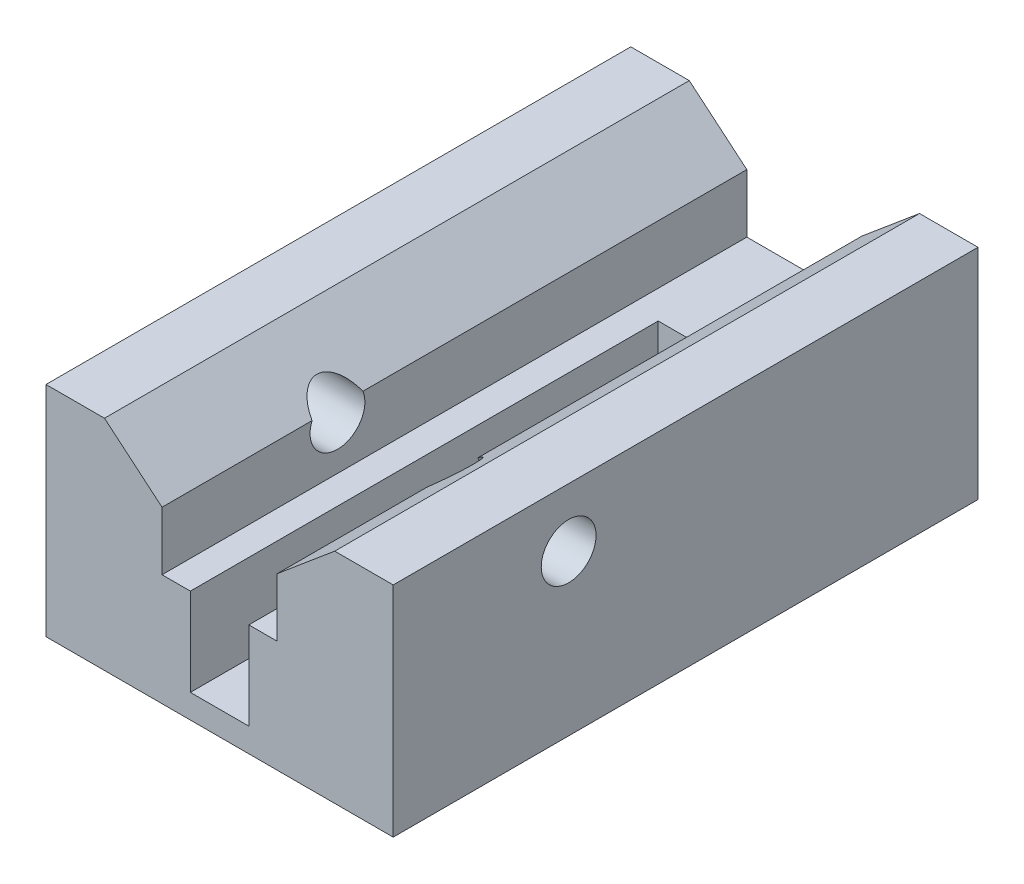
ISO-10303-21;
HEADER;
FILE_DESCRIPTION(('STEP AP214'),'2;1');
FILE_NAME('part.step','',(''),(''),'','','');
FILE_SCHEMA(('AUTOMOTIVE_DESIGN { 1 0 10303 214 1 1 1 1 }'));
ENDSEC;
DATA;
#1=APPLICATION_CONTEXT('core data for automotive mechanical design processes');
#2=APPLICATION_PROTOCOL_DEFINITION('international standard','automotive_design',2000,#1);
#3=PRODUCT_CONTEXT('',#1,'mechanical');
#4=PRODUCT('Part','Part','',(#3));
#5=PRODUCT_RELATED_PRODUCT_CATEGORY('part','',(#4));
#6=PRODUCT_DEFINITION_FORMATION('','',#4);
#7=PRODUCT_DEFINITION_CONTEXT('part definition',#1,'design');
#8=PRODUCT_DEFINITION('design','',#6,#7);
#9=PRODUCT_DEFINITION_SHAPE('','',#8);
#10=(LENGTH_UNIT() NAMED_UNIT(*) SI_UNIT(.MILLI.,.METRE.));
#11=(NAMED_UNIT(*) PLANE_ANGLE_UNIT() SI_UNIT($,.RADIAN.));
#12=(NAMED_UNIT(*) SI_UNIT($,.STERADIAN.) SOLID_ANGLE_UNIT());
#13=UNCERTAINTY_MEASURE_WITH_UNIT(LENGTH_MEASURE(1.E-05),#10,'distance_accuracy_value','');
#14=(GEOMETRIC_REPRESENTATION_CONTEXT(3) GLOBAL_UNCERTAINTY_ASSIGNED_CONTEXT((#13)) GLOBAL_UNIT_ASSIGNED_CONTEXT((#10,
#11,#12)) REPRESENTATION_CONTEXT('',''));
#15=CARTESIAN_POINT('',(0.,0.,0.));
#16=DIRECTION('',(0.,0.,1.));
#17=DIRECTION('',(1.,0.,0.));
#18=AXIS2_PLACEMENT_3D('',#15,#16,#17);
#19=CARTESIAN_POINT('',(-2.5,2.54,25.4));
#20=DIRECTION('',(-0.642787609686543,-0.766044443118975,0.));
#21=DIRECTION('',(0.766044443118975,-0.642787609686543,0.));
#22=AXIS2_PLACEMENT_3D('',#19,#20,#21);
#23=PLANE('',#22);
#24=DIRECTION('',(0.,0.,-1.));
#25=VECTOR('',#24,1.);
#26=CARTESIAN_POINT('',(-2.5,2.54,25.4));
#27=LINE('',#26,#25);
#28=CARTESIAN_POINT('',(-2.5,2.54,25.4));
#29=VERTEX_POINT('',#28);
#30=CARTESIAN_POINT('',(-2.5,2.54,18.885441998734));
#31=VERTEX_POINT('',#30);
#32=EDGE_CURVE('E151',#29,#31,#27,.T.);
#33=ORIENTED_EDGE('',*,*,#32,.T.);
#34=CARTESIAN_POINT('',(-1.97294587481074,2.09774907794322,17.78));
#35=DIRECTION('',(-0.642787609686543,-0.766044443118975,0.));
#36=DIRECTION('',(0.766044443118975,-0.642787609686543,0.));
#37=AXIS2_PLACEMENT_3D('',#34,#35,#36);
#38=ELLIPSE('',#37,1.85228368135567,1.190625);
#39=CARTESIAN_POINT('',(-2.5,2.54,16.674558001266));
#40=VERTEX_POINT('',#39);
#41=EDGE_CURVE('E53',#31,#40,#38,.T.);
#42=ORIENTED_EDGE('',*,*,#41,.T.);
#43=CARTESIAN_POINT('',(-2.5,2.54,0.));
#44=VERTEX_POINT('',#43);
#45=EDGE_CURVE('E148',#40,#44,#27,.T.);
#46=ORIENTED_EDGE('',*,*,#45,.T.);
#47=DIRECTION('',(-0.766044443118975,0.642787609686543,0.));
#48=VECTOR('',#47,1.);
#49=CARTESIAN_POINT('',(-2.5,2.54,0.));
#50=LINE('',#49,#48);
#51=CARTESIAN_POINT('',(-5.,4.63774907794322,0.));
#52=VERTEX_POINT('',#51);
#53=EDGE_CURVE('E198',#44,#52,#50,.T.);
#54=ORIENTED_EDGE('',*,*,#53,.T.);
#55=DIRECTION('',(0.,0.,-1.));
#56=VECTOR('',#55,1.);
#57=CARTESIAN_POINT('',(-5.,4.63774907794322,25.4));
#58=LINE('',#57,#56);
#59=CARTESIAN_POINT('',(-5.,4.63774907794322,25.4));
#60=VERTEX_POINT('',#59);
#61=EDGE_CURVE('E40',#60,#52,#58,.T.);
#62=ORIENTED_EDGE('',*,*,#61,.F.);
#63=DIRECTION('',(-0.766044443118975,0.642787609686543,0.));
#64=VECTOR('',#63,1.);
#65=CARTESIAN_POINT('',(-2.5,2.54,25.4));
#66=LINE('',#65,#64);
#67=EDGE_CURVE('E223',#29,#60,#66,.T.);
#68=ORIENTED_EDGE('',*,*,#67,.F.);
#69=EDGE_LOOP('',(#33,#42,#46,#54,#62,#68));
#70=FACE_BOUND('',#69,.T.);
#71=ADVANCED_FACE('F33',(#70),#23,.F.);
#72=CARTESIAN_POINT('',(-5.,4.63774907794322,25.4));
#73=DIRECTION('',(0.,-1.,0.));
#74=DIRECTION('',(1.,0.,0.));
#75=AXIS2_PLACEMENT_3D('',#72,#73,#74);
#76=PLANE('',#75);
#77=DIRECTION('',(-1.,0.,0.));
#78=VECTOR('',#77,1.);
#79=CARTESIAN_POINT('',(-5.,4.63774907794322,0.));
#80=LINE('',#79,#78);
#81=CARTESIAN_POINT('',(-7.54,4.63774907794322,0.));
#82=VERTEX_POINT('',#81);
#83=EDGE_CURVE('E195',#52,#82,#80,.T.);
#84=ORIENTED_EDGE('',*,*,#83,.T.);
#85=DIRECTION('',(0.,0.,-1.));
#86=VECTOR('',#85,1.);
#87=CARTESIAN_POINT('',(-7.54,4.63774907794322,25.4));
#88=LINE('',#87,#86);
#89=CARTESIAN_POINT('',(-7.54,4.63774907794322,25.4));
#90=VERTEX_POINT('',#89);
#91=EDGE_CURVE('E188',#90,#82,#88,.T.);
#92=ORIENTED_EDGE('',*,*,#91,.F.);
#93=DIRECTION('',(-1.,0.,0.));
#94=VECTOR('',#93,1.);
#95=CARTESIAN_POINT('',(-5.,4.63774907794322,25.4));
#96=LINE('',#95,#94);
#97=EDGE_CURVE('E196',#60,#90,#96,.T.);
#98=ORIENTED_EDGE('',*,*,#97,.F.);
#99=ORIENTED_EDGE('',*,*,#61,.T.);
#100=EDGE_LOOP('',(#84,#92,#98,#99));
#101=FACE_BOUND('',#100,.T.);
#102=ADVANCED_FACE('F193',(#101),#76,.F.);
#103=CARTESIAN_POINT('',(-7.54,4.63774907794322,25.4));
#104=DIRECTION('',(1.,0.,0.));
#105=DIRECTION('',(0.,1.,0.));
#106=AXIS2_PLACEMENT_3D('',#103,#104,#105);
#107=PLANE('',#106);
#108=CARTESIAN_POINT('',(-7.54,2.09774907794322,17.78));
#109=DIRECTION('',(1.,0.,0.));
#110=DIRECTION('',(0.,1.,0.));
#111=AXIS2_PLACEMENT_3D('',#108,#109,#110);
#112=CIRCLE('',#111,1.190625);
#113=CARTESIAN_POINT('',(-7.54,3.28837407794322,17.78));
#114=VERTEX_POINT('',#113);
#115=EDGE_CURVE('E153',#114,#114,#112,.T.);
#116=ORIENTED_EDGE('',*,*,#115,.T.);
#117=EDGE_LOOP('',(#116));
#118=FACE_BOUND('',#117,.T.);
#119=DIRECTION('',(0.,-1.,0.));
#120=VECTOR('',#119,1.);
#121=CARTESIAN_POINT('',(-7.54,4.63774907794322,0.));
#122=LINE('',#121,#120);
#123=CARTESIAN_POINT('',(-7.54,-4.85143615091344,0.));
#124=VERTEX_POINT('',#123);
#125=EDGE_CURVE('E202',#82,#124,#122,.T.);
#126=ORIENTED_EDGE('',*,*,#125,.T.);
#127=DIRECTION('',(0.,0.,-1.));
#128=VECTOR('',#127,1.);
#129=CARTESIAN_POINT('',(-7.54,-4.85143615091344,25.4));
#130=LINE('',#129,#128);
#131=CARTESIAN_POINT('',(-7.54,-4.85143615091344,25.4));
#132=VERTEX_POINT('',#131);
#133=EDGE_CURVE('E185',#132,#124,#130,.T.);
#134=ORIENTED_EDGE('',*,*,#133,.F.);
#135=DIRECTION('',(0.,-1.,0.));
#136=VECTOR('',#135,1.);
#137=CARTESIAN_POINT('',(-7.54,4.63774907794322,25.4));
#138=LINE('',#137,#136);
#139=EDGE_CURVE('E226',#90,#132,#138,.T.);
#140=ORIENTED_EDGE('',*,*,#139,.F.);
#141=ORIENTED_EDGE('',*,*,#91,.T.);
#142=EDGE_LOOP('',(#126,#134,#140,#141));
#143=FACE_BOUND('',#142,.T.);
#144=ADVANCED_FACE('F298',(#118,#143),#107,.F.);
#145=CARTESIAN_POINT('',(-7.54,-4.85143615091344,25.4));
#146=DIRECTION('',(0.,1.,0.));
#147=DIRECTION('',(0.,0.,1.));
#148=AXIS2_PLACEMENT_3D('',#145,#146,#147);
#149=PLANE('',#148);
#150=DIRECTION('',(1.,0.,0.));
#151=VECTOR('',#150,1.);
#152=CARTESIAN_POINT('',(-7.54,-4.85143615091344,0.));
#153=LINE('',#152,#151);
#154=CARTESIAN_POINT('',(7.54,-4.85143615091344,0.));
#155=VERTEX_POINT('',#154);
#156=EDGE_CURVE('E209',#124,#155,#153,.T.);
#157=ORIENTED_EDGE('',*,*,#156,.T.);
#158=DIRECTION('',(0.,0.,-1.));
#159=VECTOR('',#158,1.);
#160=CARTESIAN_POINT('',(7.54,-4.85143615091344,25.4));
#161=LINE('',#160,#159);
#162=CARTESIAN_POINT('',(7.54,-4.85143615091344,25.4));
#163=VERTEX_POINT('',#162);
#164=EDGE_CURVE('E182',#163,#155,#161,.T.);
#165=ORIENTED_EDGE('',*,*,#164,.F.);
#166=DIRECTION('',(1.,0.,0.));
#167=VECTOR('',#166,1.);
#168=CARTESIAN_POINT('',(-7.54,-4.85143615091344,25.4));
#169=LINE('',#168,#167);
#170=EDGE_CURVE('E233',#132,#163,#169,.T.);
#171=ORIENTED_EDGE('',*,*,#170,.F.);
#172=ORIENTED_EDGE('',*,*,#133,.T.);
#173=EDGE_LOOP('',(#157,#165,#171,#172));
#174=FACE_BOUND('',#173,.T.);
#175=ADVANCED_FACE('F319',(#174),#149,.F.);
#176=CARTESIAN_POINT('',(7.54,4.63774907794322,25.4));
#177=DIRECTION('',(-1.,0.,0.));
#178=DIRECTION('',(0.,-1.,0.));
#179=AXIS2_PLACEMENT_3D('',#176,#177,#178);
#180=PLANE('',#179);
#181=CARTESIAN_POINT('',(7.54,2.09774907794322,17.78));
#182=DIRECTION('',(1.,0.,0.));
#183=DIRECTION('',(0.,1.,0.));
#184=AXIS2_PLACEMENT_3D('',#181,#182,#183);
#185=CIRCLE('',#184,1.190625);
#186=CARTESIAN_POINT('',(7.54,3.28837407794322,17.78));
#187=VERTEX_POINT('',#186);
#188=EDGE_CURVE('E292',#187,#187,#185,.T.);
#189=ORIENTED_EDGE('',*,*,#188,.F.);
#190=EDGE_LOOP('',(#189));
#191=FACE_BOUND('',#190,.T.);
#192=DIRECTION('',(0.,1.,0.));
#193=VECTOR('',#192,1.);
#194=CARTESIAN_POINT('',(7.54,4.63774907794322,0.));
#195=LINE('',#194,#193);
#196=CARTESIAN_POINT('',(7.54,4.63774907794322,0.));
#197=VERTEX_POINT('',#196);
#198=EDGE_CURVE('E211',#155,#197,#195,.T.);
#199=ORIENTED_EDGE('',*,*,#198,.T.);
#200=DIRECTION('',(0.,0.,-1.));
#201=VECTOR('',#200,1.);
#202=CARTESIAN_POINT('',(7.54,4.63774907794322,25.4));
#203=LINE('',#202,#201);
#204=CARTESIAN_POINT('',(7.54,4.63774907794322,25.4));
#205=VERTEX_POINT('',#204);
#206=EDGE_CURVE('E179',#205,#197,#203,.T.);
#207=ORIENTED_EDGE('',*,*,#206,.F.);
#208=DIRECTION('',(0.,1.,0.));
#209=VECTOR('',#208,1.);
#210=CARTESIAN_POINT('',(7.54,4.63774907794322,25.4));
#211=LINE('',#210,#209);
#212=EDGE_CURVE('E235',#163,#205,#211,.T.);
#213=ORIENTED_EDGE('',*,*,#212,.F.);
#214=ORIENTED_EDGE('',*,*,#164,.T.);
#215=EDGE_LOOP('',(#199,#207,#213,#214));
#216=FACE_BOUND('',#215,.T.);
#217=ADVANCED_FACE('F324',(#191,#216),#180,.F.);
#218=CARTESIAN_POINT('',(5.,4.63774907794322,25.4));
#219=DIRECTION('',(0.,-1.,0.));
#220=DIRECTION('',(1.,0.,0.));
#221=AXIS2_PLACEMENT_3D('',#218,#219,#220);
#222=PLANE('',#221);
#223=DIRECTION('',(-1.,0.,0.));
#224=VECTOR('',#223,1.);
#225=CARTESIAN_POINT('',(5.,4.63774907794322,0.));
#226=LINE('',#225,#224);
#227=CARTESIAN_POINT('',(5.,4.63774907794322,0.));
#228=VERTEX_POINT('',#227);
#229=EDGE_CURVE('E213',#197,#228,#226,.T.);
#230=ORIENTED_EDGE('',*,*,#229,.T.);
#231=DIRECTION('',(0.,0.,-1.));
#232=VECTOR('',#231,1.);
#233=CARTESIAN_POINT('',(5.,4.63774907794322,25.4));
#234=LINE('',#233,#232);
#235=CARTESIAN_POINT('',(5.,4.63774907794322,25.4));
#236=VERTEX_POINT('',#235);
#237=EDGE_CURVE('E176',#236,#228,#234,.T.);
#238=ORIENTED_EDGE('',*,*,#237,.F.);
#239=DIRECTION('',(-1.,0.,0.));
#240=VECTOR('',#239,1.);
#241=CARTESIAN_POINT('',(5.,4.63774907794322,25.4));
#242=LINE('',#241,#240);
#243=EDGE_CURVE('E237',#205,#236,#242,.T.);
#244=ORIENTED_EDGE('',*,*,#243,.F.);
#245=ORIENTED_EDGE('',*,*,#206,.T.);
#246=EDGE_LOOP('',(#230,#238,#244,#245));
#247=FACE_BOUND('',#246,.T.);
#248=ADVANCED_FACE('F328',(#247),#222,.F.);
#249=CARTESIAN_POINT('',(5.,4.63774907794322,25.4));
#250=DIRECTION('',(0.642787609686543,-0.766044443118975,0.));
#251=DIRECTION('',(0.766044443118975,0.642787609686543,0.));
#252=AXIS2_PLACEMENT_3D('',#249,#250,#251);
#253=PLANE('',#252);
#254=DIRECTION('',(0.,0.,-1.));
#255=VECTOR('',#254,1.);
#256=CARTESIAN_POINT('',(2.5,2.54,25.4));
#257=LINE('',#256,#255);
#258=CARTESIAN_POINT('',(2.5,2.54,16.674558001266));
#259=VERTEX_POINT('',#258);
#260=CARTESIAN_POINT('',(2.5,2.54,0.));
#261=VERTEX_POINT('',#260);
#262=EDGE_CURVE('E172',#259,#261,#257,.T.);
#263=ORIENTED_EDGE('',*,*,#262,.F.);
#264=CARTESIAN_POINT('',(1.97294587481074,2.09774907794322,17.78));
#265=DIRECTION('',(0.642787609686543,-0.766044443118975,0.));
#266=DIRECTION('',(0.766044443118975,0.642787609686543,0.));
#267=AXIS2_PLACEMENT_3D('',#264,#265,#266);
#268=ELLIPSE('',#267,1.85228368135567,1.190625);
#269=CARTESIAN_POINT('',(2.5,2.54,18.885441998734));
#270=VERTEX_POINT('',#269);
#271=EDGE_CURVE('E46',#259,#270,#268,.T.);
#272=ORIENTED_EDGE('',*,*,#271,.T.);
#273=CARTESIAN_POINT('',(2.5,2.54,25.4));
#274=VERTEX_POINT('',#273);
#275=EDGE_CURVE('E173',#274,#270,#257,.T.);
#276=ORIENTED_EDGE('',*,*,#275,.F.);
#277=DIRECTION('',(-0.766044443118975,-0.642787609686543,0.));
#278=VECTOR('',#277,1.);
#279=CARTESIAN_POINT('',(5.,4.63774907794322,25.4));
#280=LINE('',#279,#278);
#281=EDGE_CURVE('E239',#236,#274,#280,.T.);
#282=ORIENTED_EDGE('',*,*,#281,.F.);
#283=ORIENTED_EDGE('',*,*,#237,.T.);
#284=DIRECTION('',(-0.766044443118975,-0.642787609686543,0.));
#285=VECTOR('',#284,1.);
#286=CARTESIAN_POINT('',(5.,4.63774907794322,0.));
#287=LINE('',#286,#285);
#288=EDGE_CURVE('E215',#228,#261,#287,.T.);
#289=ORIENTED_EDGE('',*,*,#288,.T.);
#290=EDGE_LOOP('',(#263,#272,#276,#282,#283,#289));
#291=FACE_BOUND('',#290,.T.);
#292=ADVANCED_FACE('F332',(#291),#253,.F.);
#293=CARTESIAN_POINT('',(2.5,0.,25.4));
#294=DIRECTION('',(1.,0.,0.));
#295=DIRECTION('',(0.,0.,-1.));
#296=AXIS2_PLACEMENT_3D('',#293,#294,#295);
#297=PLANE('',#296);
#298=ORIENTED_EDGE('',*,*,#275,.T.);
#299=CARTESIAN_POINT('',(2.5,2.09774907794322,17.78));
#300=DIRECTION('',(1.,0.,0.));
#301=DIRECTION('',(0.,0.,-1.));
#302=AXIS2_PLACEMENT_3D('',#299,#300,#301);
#303=CIRCLE('',#302,1.190625);
#304=EDGE_CURVE('E152',#270,#259,#303,.T.);
#305=ORIENTED_EDGE('',*,*,#304,.T.);
#306=ORIENTED_EDGE('',*,*,#262,.T.);
#307=DIRECTION('',(0.,-1.,0.));
#308=VECTOR('',#307,1.);
#309=CARTESIAN_POINT('',(2.5,0.,0.));
#310=LINE('',#309,#308);
#311=CARTESIAN_POINT('',(2.5,0.,0.));
#312=VERTEX_POINT('',#311);
#313=EDGE_CURVE('E218',#261,#312,#310,.T.);
#314=ORIENTED_EDGE('',*,*,#313,.T.);
#315=DIRECTION('',(0.,0.,-1.));
#316=VECTOR('',#315,1.);
#317=CARTESIAN_POINT('',(2.5,0.,25.4));
#318=LINE('',#317,#316);
#319=CARTESIAN_POINT('',(2.5,0.,25.4));
#320=VERTEX_POINT('',#319);
#321=EDGE_CURVE('E169',#320,#312,#318,.T.);
#322=ORIENTED_EDGE('',*,*,#321,.F.);
#323=DIRECTION('',(0.,-1.,0.));
#324=VECTOR('',#323,1.);
#325=CARTESIAN_POINT('',(2.5,0.,25.4));
#326=LINE('',#325,#324);
#327=EDGE_CURVE('E241',#274,#320,#326,.T.);
#328=ORIENTED_EDGE('',*,*,#327,.F.);
#329=EDGE_LOOP('',(#298,#305,#306,#314,#322,#328));
#330=FACE_BOUND('',#329,.T.);
#331=ADVANCED_FACE('F260',(#330),#297,.F.);
#332=CARTESIAN_POINT('',(-2.5,0.,25.4));
#333=DIRECTION('',(0.,-1.,0.));
#334=DIRECTION('',(0.,0.,-1.));
#335=AXIS2_PLACEMENT_3D('',#332,#333,#334);
#336=PLANE('',#335);
#337=DIRECTION('',(-1.,0.,0.));
#338=VECTOR('',#337,1.);
#339=CARTESIAN_POINT('',(-2.5,0.,25.4));
#340=LINE('',#339,#338);
#341=CARTESIAN_POINT('',(-1.27,0.,25.4));
#342=VERTEX_POINT('',#341);
#343=CARTESIAN_POINT('',(-2.5,0.,25.4));
#344=VERTEX_POINT('',#343);
#345=EDGE_CURVE('E242',#342,#344,#340,.T.);
#346=ORIENTED_EDGE('',*,*,#345,.F.);
#347=DIRECTION('',(0.,0.,1.));
#348=VECTOR('',#347,1.);
#349=CARTESIAN_POINT('',(-1.27,0.,5.08));
#350=LINE('',#349,#348);
#351=CARTESIAN_POINT('',(-1.27,0.,5.08));
#352=VERTEX_POINT('',#351);
#353=EDGE_CURVE('E270',#352,#342,#350,.T.);
#354=ORIENTED_EDGE('',*,*,#353,.F.);
#355=DIRECTION('',(-1.,0.,0.));
#356=VECTOR('',#355,1.);
#357=CARTESIAN_POINT('',(-1.27,0.,5.08));
#358=LINE('',#357,#356);
#359=CARTESIAN_POINT('',(1.27,0.,5.08));
#360=VERTEX_POINT('',#359);
#361=EDGE_CURVE('E268',#360,#352,#358,.T.);
#362=ORIENTED_EDGE('',*,*,#361,.F.);
#363=DIRECTION('',(0.,0.,-1.));
#364=VECTOR('',#363,1.);
#365=CARTESIAN_POINT('',(1.27,0.,5.08));
#366=LINE('',#365,#364);
#367=CARTESIAN_POINT('',(1.27,0.,25.4));
#368=VERTEX_POINT('',#367);
#369=EDGE_CURVE('E266',#368,#360,#366,.T.);
#370=ORIENTED_EDGE('',*,*,#369,.F.);
#371=EDGE_CURVE('E163',#320,#368,#340,.T.);
#372=ORIENTED_EDGE('',*,*,#371,.F.);
#373=ORIENTED_EDGE('',*,*,#321,.T.);
#374=DIRECTION('',(-1.,0.,0.));
#375=VECTOR('',#374,1.);
#376=CARTESIAN_POINT('',(-2.5,0.,0.));
#377=LINE('',#376,#375);
#378=CARTESIAN_POINT('',(-2.5,0.,0.));
#379=VERTEX_POINT('',#378);
#380=EDGE_CURVE('E219',#312,#379,#377,.T.);
#381=ORIENTED_EDGE('',*,*,#380,.T.);
#382=DIRECTION('',(0.,0.,-1.));
#383=VECTOR('',#382,1.);
#384=CARTESIAN_POINT('',(-2.5,0.,25.4));
#385=LINE('',#384,#383);
#386=EDGE_CURVE('E162',#344,#379,#385,.T.);
#387=ORIENTED_EDGE('',*,*,#386,.F.);
#388=EDGE_LOOP('',(#346,#354,#362,#370,#372,#373,#381,#387));
#389=FACE_BOUND('',#388,.T.);
#390=ADVANCED_FACE('F253',(#389),#336,.F.);
#391=CARTESIAN_POINT('',(-2.5,2.54,25.4));
#392=DIRECTION('',(-1.,0.,0.));
#393=DIRECTION('',(0.,0.,1.));
#394=AXIS2_PLACEMENT_3D('',#391,#392,#393);
#395=PLANE('',#394);
#396=ORIENTED_EDGE('',*,*,#45,.F.);
#397=CARTESIAN_POINT('',(-2.5,2.09774907794322,17.78));
#398=DIRECTION('',(-1.,0.,0.));
#399=DIRECTION('',(0.,0.,1.));
#400=AXIS2_PLACEMENT_3D('',#397,#398,#399);
#401=CIRCLE('',#400,1.190625);
#402=EDGE_CURVE('E11',#40,#31,#401,.T.);
#403=ORIENTED_EDGE('',*,*,#402,.T.);
#404=ORIENTED_EDGE('',*,*,#32,.F.);
#405=DIRECTION('',(0.,1.,0.));
#406=VECTOR('',#405,1.);
#407=CARTESIAN_POINT('',(-2.5,2.54,25.4));
#408=LINE('',#407,#406);
#409=EDGE_CURVE('E160',#344,#29,#408,.T.);
#410=ORIENTED_EDGE('',*,*,#409,.F.);
#411=ORIENTED_EDGE('',*,*,#386,.T.);
#412=DIRECTION('',(0.,1.,0.));
#413=VECTOR('',#412,1.);
#414=CARTESIAN_POINT('',(-2.5,2.54,0.));
#415=LINE('',#414,#413);
#416=EDGE_CURVE('E158',#379,#44,#415,.T.);
#417=ORIENTED_EDGE('',*,*,#416,.T.);
#418=EDGE_LOOP('',(#396,#403,#404,#410,#411,#417));
#419=FACE_BOUND('',#418,.T.);
#420=ADVANCED_FACE('F155',(#419),#395,.F.);
#421=CARTESIAN_POINT('',(0.,0.,25.4));
#422=DIRECTION('',(0.,0.,1.));
#423=DIRECTION('',(1.,0.,0.));
#424=AXIS2_PLACEMENT_3D('',#421,#422,#423);
#425=PLANE('',#424);
#426=DIRECTION('',(0.,1.,0.));
#427=VECTOR('',#426,1.);
#428=CARTESIAN_POINT('',(-1.27,-3.81,25.4));
#429=LINE('',#428,#427);
#430=CARTESIAN_POINT('',(-1.27,-3.81,25.4));
#431=VERTEX_POINT('',#430);
#432=EDGE_CURVE('E229',#431,#342,#429,.T.);
#433=ORIENTED_EDGE('',*,*,#432,.T.);
#434=ORIENTED_EDGE('',*,*,#345,.T.);
#435=ORIENTED_EDGE('',*,*,#409,.T.);
#436=ORIENTED_EDGE('',*,*,#67,.T.);
#437=ORIENTED_EDGE('',*,*,#97,.T.);
#438=ORIENTED_EDGE('',*,*,#139,.T.);
#439=ORIENTED_EDGE('',*,*,#170,.T.);
#440=ORIENTED_EDGE('',*,*,#212,.T.);
#441=ORIENTED_EDGE('',*,*,#243,.T.);
#442=ORIENTED_EDGE('',*,*,#281,.T.);
#443=ORIENTED_EDGE('',*,*,#327,.T.);
#444=ORIENTED_EDGE('',*,*,#371,.T.);
#445=DIRECTION('',(0.,1.,0.));
#446=VECTOR('',#445,1.);
#447=CARTESIAN_POINT('',(1.27,-3.81,25.4));
#448=LINE('',#447,#446);
#449=CARTESIAN_POINT('',(1.27,-3.81,25.4));
#450=VERTEX_POINT('',#449);
#451=EDGE_CURVE('E277',#450,#368,#448,.T.);
#452=ORIENTED_EDGE('',*,*,#451,.F.);
#453=DIRECTION('',(1.,0.,0.));
#454=VECTOR('',#453,1.);
#455=CARTESIAN_POINT('',(-1.27,-3.81,25.4));
#456=LINE('',#455,#454);
#457=EDGE_CURVE('E284',#431,#450,#456,.T.);
#458=ORIENTED_EDGE('',*,*,#457,.F.);
#459=EDGE_LOOP('',(#433,#434,#435,#436,#437,#438,#439,#440,#441,#442,#443,#444,#452,#458));
#460=FACE_BOUND('',#459,.T.);
#461=ADVANCED_FACE('F248',(#460),#425,.T.);
#462=CARTESIAN_POINT('',(0.,0.,0.));
#463=DIRECTION('',(0.,0.,1.));
#464=DIRECTION('',(1.,0.,0.));
#465=AXIS2_PLACEMENT_3D('',#462,#463,#464);
#466=PLANE('',#465);
#467=ORIENTED_EDGE('',*,*,#53,.F.);
#468=ORIENTED_EDGE('',*,*,#416,.F.);
#469=ORIENTED_EDGE('',*,*,#380,.F.);
#470=ORIENTED_EDGE('',*,*,#313,.F.);
#471=ORIENTED_EDGE('',*,*,#288,.F.);
#472=ORIENTED_EDGE('',*,*,#229,.F.);
#473=ORIENTED_EDGE('',*,*,#198,.F.);
#474=ORIENTED_EDGE('',*,*,#156,.F.);
#475=ORIENTED_EDGE('',*,*,#125,.F.);
#476=ORIENTED_EDGE('',*,*,#83,.F.);
#477=EDGE_LOOP('',(#467,#468,#469,#470,#471,#472,#473,#474,#475,#476));
#478=FACE_BOUND('',#477,.T.);
#479=ADVANCED_FACE('F254',(#478),#466,.F.);
#480=CARTESIAN_POINT('',(-1.27,-3.81,5.08));
#481=DIRECTION('',(-1.,0.,0.));
#482=DIRECTION('',(0.,0.,1.));
#483=AXIS2_PLACEMENT_3D('',#480,#481,#482);
#484=PLANE('',#483);
#485=ORIENTED_EDGE('',*,*,#353,.T.);
#486=ORIENTED_EDGE('',*,*,#432,.F.);
#487=DIRECTION('',(0.,0.,1.));
#488=VECTOR('',#487,1.);
#489=CARTESIAN_POINT('',(-1.27,-3.81,5.08));
#490=LINE('',#489,#488);
#491=CARTESIAN_POINT('',(-1.27,-3.81,5.08));
#492=VERTEX_POINT('',#491);
#493=EDGE_CURVE('E272',#492,#431,#490,.T.);
#494=ORIENTED_EDGE('',*,*,#493,.F.);
#495=DIRECTION('',(0.,1.,0.));
#496=VECTOR('',#495,1.);
#497=CARTESIAN_POINT('',(-1.27,-3.81,5.08));
#498=LINE('',#497,#496);
#499=EDGE_CURVE('E200',#492,#352,#498,.T.);
#500=ORIENTED_EDGE('',*,*,#499,.T.);
#501=EDGE_LOOP('',(#485,#486,#494,#500));
#502=FACE_BOUND('',#501,.T.);
#503=ADVANCED_FACE('F345',(#502),#484,.F.);
#504=CARTESIAN_POINT('',(-1.27,-3.81,5.08));
#505=DIRECTION('',(0.,0.,-1.));
#506=DIRECTION('',(-1.,0.,0.));
#507=AXIS2_PLACEMENT_3D('',#504,#505,#506);
#508=PLANE('',#507);
#509=ORIENTED_EDGE('',*,*,#361,.T.);
#510=ORIENTED_EDGE('',*,*,#499,.F.);
#511=DIRECTION('',(-1.,0.,0.));
#512=VECTOR('',#511,1.);
#513=CARTESIAN_POINT('',(-1.27,-3.81,5.08));
#514=LINE('',#513,#512);
#515=CARTESIAN_POINT('',(1.27,-3.81,5.08));
#516=VERTEX_POINT('',#515);
#517=EDGE_CURVE('E278',#516,#492,#514,.T.);
#518=ORIENTED_EDGE('',*,*,#517,.F.);
#519=DIRECTION('',(0.,1.,0.));
#520=VECTOR('',#519,1.);
#521=CARTESIAN_POINT('',(1.27,-3.81,5.08));
#522=LINE('',#521,#520);
#523=EDGE_CURVE('E204',#516,#360,#522,.T.);
#524=ORIENTED_EDGE('',*,*,#523,.T.);
#525=EDGE_LOOP('',(#509,#510,#518,#524));
#526=FACE_BOUND('',#525,.T.);
#527=ADVANCED_FACE('F350',(#526),#508,.F.);
#528=CARTESIAN_POINT('',(1.27,-3.81,5.08));
#529=DIRECTION('',(1.,0.,0.));
#530=DIRECTION('',(0.,0.,-1.));
#531=AXIS2_PLACEMENT_3D('',#528,#529,#530);
#532=PLANE('',#531);
#533=ORIENTED_EDGE('',*,*,#369,.T.);
#534=ORIENTED_EDGE('',*,*,#523,.F.);
#535=DIRECTION('',(0.,0.,-1.));
#536=VECTOR('',#535,1.);
#537=CARTESIAN_POINT('',(1.27,-3.81,5.08));
#538=LINE('',#537,#536);
#539=EDGE_CURVE('E280',#450,#516,#538,.T.);
#540=ORIENTED_EDGE('',*,*,#539,.F.);
#541=ORIENTED_EDGE('',*,*,#451,.T.);
#542=EDGE_LOOP('',(#533,#534,#540,#541));
#543=FACE_BOUND('',#542,.T.);
#544=ADVANCED_FACE('F310',(#543),#532,.F.);
#545=CARTESIAN_POINT('',(0.,-3.81,0.));
#546=DIRECTION('',(0.,1.,0.));
#547=DIRECTION('',(0.,0.,1.));
#548=AXIS2_PLACEMENT_3D('',#545,#546,#547);
#549=PLANE('',#548);
#550=ORIENTED_EDGE('',*,*,#493,.T.);
#551=ORIENTED_EDGE('',*,*,#457,.T.);
#552=ORIENTED_EDGE('',*,*,#539,.T.);
#553=ORIENTED_EDGE('',*,*,#517,.T.);
#554=EDGE_LOOP('',(#550,#551,#552,#553));
#555=FACE_BOUND('',#554,.T.);
#556=ADVANCED_FACE('F303',(#555),#549,.T.);
#557=CARTESIAN_POINT('',(-7.54,2.09774907794322,17.78));
#558=DIRECTION('',(1.,0.,0.));
#559=DIRECTION('',(0.,1.,0.));
#560=AXIS2_PLACEMENT_3D('',#557,#558,#559);
#561=CYLINDRICAL_SURFACE('',#560,1.190625);
#562=ORIENTED_EDGE('',*,*,#115,.F.);
#563=EDGE_LOOP('',(#562));
#564=FACE_BOUND('',#563,.T.);
#565=ORIENTED_EDGE('',*,*,#402,.F.);
#566=ORIENTED_EDGE('',*,*,#41,.F.);
#567=EDGE_LOOP('',(#565,#566));
#568=FACE_BOUND('',#567,.T.);
#569=ADVANCED_FACE('F141',(#564,#568),#561,.F.);
#570=ORIENTED_EDGE('',*,*,#188,.T.);
#571=EDGE_LOOP('',(#570));
#572=FACE_BOUND('',#571,.T.);
#573=ORIENTED_EDGE('',*,*,#304,.F.);
#574=ORIENTED_EDGE('',*,*,#271,.F.);
#575=EDGE_LOOP('',(#573,#574));
#576=FACE_BOUND('',#575,.T.);
#577=ADVANCED_FACE('F302',(#572,#576),#561,.F.);
#578=CLOSED_SHELL('',(#71,#102,#144,#175,#217,#248,#292,#331,#390,#420,#461,#479,#503,#527,#544,
#556,#569,#577));
#579=MANIFOLD_SOLID_BREP('B2',#578);
#580=ADVANCED_BREP_SHAPE_REPRESENTATION('',(#18,#579),#14);
#581=SHAPE_DEFINITION_REPRESENTATION(#9,#580);
ENDSEC;
END-ISO-10303-21;
